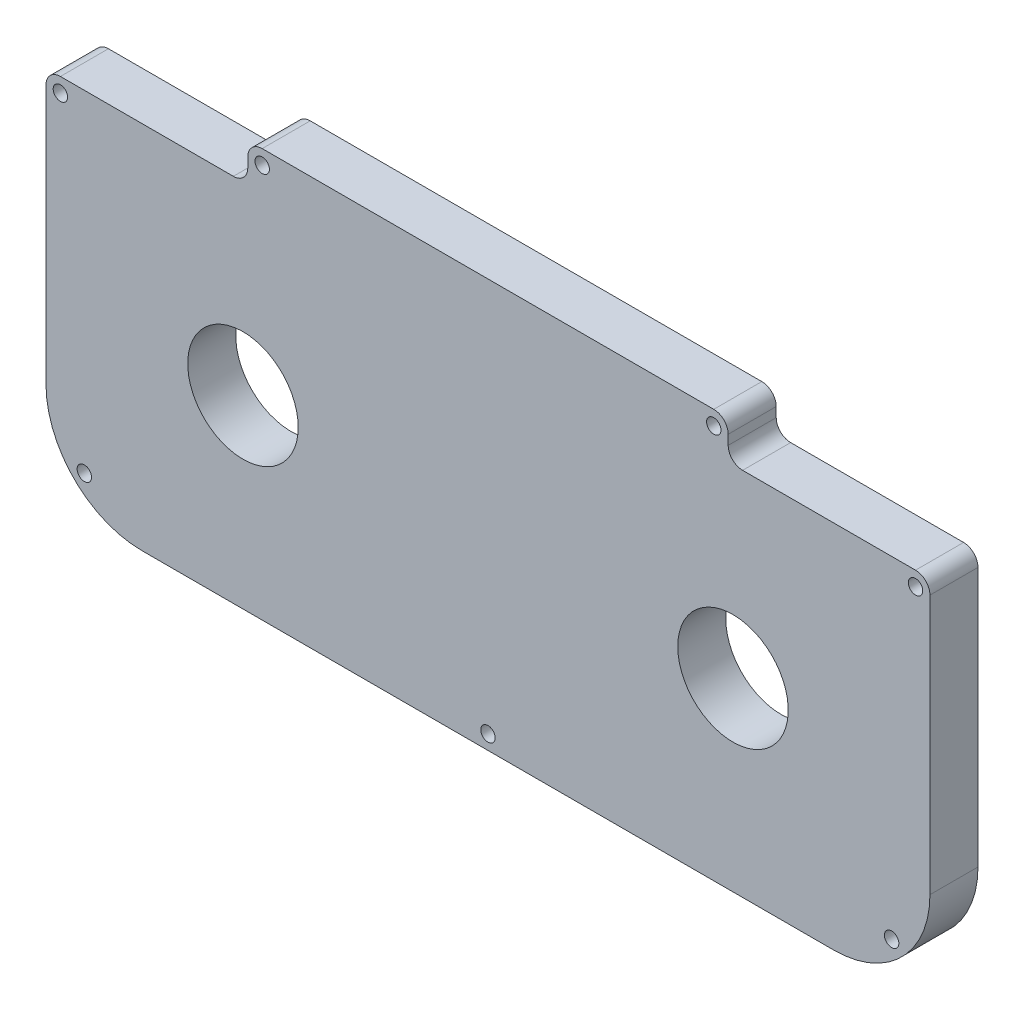
ISO-10303-21;
HEADER;
FILE_DESCRIPTION(('STEP AP214'),'2;1');
FILE_NAME('part.step','',(''),(''),'','','');
FILE_SCHEMA(('AUTOMOTIVE_DESIGN { 1 0 10303 214 1 1 1 1 }'));
ENDSEC;
DATA;
#1=APPLICATION_CONTEXT('core data for automotive mechanical design processes');
#2=APPLICATION_PROTOCOL_DEFINITION('international standard','automotive_design',2000,#1);
#3=PRODUCT_CONTEXT('',#1,'mechanical');
#4=PRODUCT('Part','Part','',(#3));
#5=PRODUCT_RELATED_PRODUCT_CATEGORY('part','',(#4));
#6=PRODUCT_DEFINITION_FORMATION('','',#4);
#7=PRODUCT_DEFINITION_CONTEXT('part definition',#1,'design');
#8=PRODUCT_DEFINITION('design','',#6,#7);
#9=PRODUCT_DEFINITION_SHAPE('','',#8);
#10=(LENGTH_UNIT() NAMED_UNIT(*) SI_UNIT(.MILLI.,.METRE.));
#11=(NAMED_UNIT(*) PLANE_ANGLE_UNIT() SI_UNIT($,.RADIAN.));
#12=(NAMED_UNIT(*) SI_UNIT($,.STERADIAN.) SOLID_ANGLE_UNIT());
#13=UNCERTAINTY_MEASURE_WITH_UNIT(LENGTH_MEASURE(1.E-05),#10,'distance_accuracy_value','');
#14=(GEOMETRIC_REPRESENTATION_CONTEXT(3) GLOBAL_UNCERTAINTY_ASSIGNED_CONTEXT((#13)) GLOBAL_UNIT_ASSIGNED_CONTEXT((#10,
#11,#12)) REPRESENTATION_CONTEXT('',''));
#15=CARTESIAN_POINT('',(0.,0.,0.));
#16=DIRECTION('',(0.,0.,1.));
#17=DIRECTION('',(1.,0.,0.));
#18=AXIS2_PLACEMENT_3D('',#15,#16,#17);
#19=CARTESIAN_POINT('',(47.,39.5,10.));
#20=DIRECTION('',(0.,0.,1.));
#21=DIRECTION('',(1.,0.,0.));
#22=AXIS2_PLACEMENT_3D('',#19,#20,#21);
#23=PLANE('',#22);
#24=CARTESIAN_POINT('',(-84.0208152801713,-34.5208152801713,10.));
#25=DIRECTION('',(0.,0.,1.));
#26=DIRECTION('',(1.,0.,0.));
#27=AXIS2_PLACEMENT_3D('',#24,#25,#26);
#28=CIRCLE('',#27,1.5);
#29=CARTESIAN_POINT('',(-82.5208152801713,-34.5208152801713,10.));
#30=VERTEX_POINT('',#29);
#31=EDGE_CURVE('E372',#30,#30,#28,.T.);
#32=ORIENTED_EDGE('',*,*,#31,.F.);
#33=EDGE_LOOP('',(#32));
#34=FACE_BOUND('',#33,.T.);
#35=CARTESIAN_POINT('',(-47.,39.5,10.));
#36=DIRECTION('',(0.,0.,1.));
#37=DIRECTION('',(1.,0.,0.));
#38=AXIS2_PLACEMENT_3D('',#35,#36,#37);
#39=CIRCLE('',#38,1.5);
#40=CARTESIAN_POINT('',(-45.5,39.5,10.));
#41=VERTEX_POINT('',#40);
#42=EDGE_CURVE('E384',#41,#41,#39,.T.);
#43=ORIENTED_EDGE('',*,*,#42,.F.);
#44=EDGE_LOOP('',(#43));
#45=FACE_BOUND('',#44,.T.);
#46=CARTESIAN_POINT('',(89.,31.5,10.));
#47=DIRECTION('',(0.,0.,1.));
#48=DIRECTION('',(1.,0.,0.));
#49=AXIS2_PLACEMENT_3D('',#46,#47,#48);
#50=CIRCLE('',#49,1.50000000000001);
#51=CARTESIAN_POINT('',(90.5,31.5,10.));
#52=VERTEX_POINT('',#51);
#53=EDGE_CURVE('E396',#52,#52,#50,.T.);
#54=ORIENTED_EDGE('',*,*,#53,.F.);
#55=EDGE_LOOP('',(#54));
#56=FACE_BOUND('',#55,.T.);
#57=CARTESIAN_POINT('',(0.,-39.5,10.));
#58=DIRECTION('',(0.,0.,1.));
#59=DIRECTION('',(1.,0.,0.));
#60=AXIS2_PLACEMENT_3D('',#57,#58,#59);
#61=CIRCLE('',#60,1.5);
#62=CARTESIAN_POINT('',(1.5,-39.5,10.));
#63=VERTEX_POINT('',#62);
#64=EDGE_CURVE('E408',#63,#63,#61,.T.);
#65=ORIENTED_EDGE('',*,*,#64,.F.);
#66=EDGE_LOOP('',(#65));
#67=FACE_BOUND('',#66,.T.);
#68=CARTESIAN_POINT('',(47.,39.5,10.));
#69=DIRECTION('',(0.,0.,1.));
#70=DIRECTION('',(1.,0.,0.));
#71=AXIS2_PLACEMENT_3D('',#68,#69,#70);
#72=CIRCLE('',#71,3.);
#73=CARTESIAN_POINT('',(50.,39.5,10.));
#74=VERTEX_POINT('',#73);
#75=CARTESIAN_POINT('',(47.,42.5,10.));
#76=VERTEX_POINT('',#75);
#77=EDGE_CURVE('E219',#74,#76,#72,.T.);
#78=ORIENTED_EDGE('',*,*,#77,.T.);
#79=DIRECTION('',(-1.,0.,0.));
#80=VECTOR('',#79,1.);
#81=CARTESIAN_POINT('',(-47.,42.5,10.));
#82=LINE('',#81,#80);
#83=CARTESIAN_POINT('',(-47.,42.5,10.));
#84=VERTEX_POINT('',#83);
#85=EDGE_CURVE('E127',#76,#84,#82,.T.);
#86=ORIENTED_EDGE('',*,*,#85,.T.);
#87=CARTESIAN_POINT('',(-47.,39.5,10.));
#88=DIRECTION('',(0.,0.,1.));
#89=DIRECTION('',(1.,0.,0.));
#90=AXIS2_PLACEMENT_3D('',#87,#88,#89);
#91=CIRCLE('',#90,3.);
#92=CARTESIAN_POINT('',(-50.,39.5,10.));
#93=VERTEX_POINT('',#92);
#94=EDGE_CURVE('E258',#84,#93,#91,.T.);
#95=ORIENTED_EDGE('',*,*,#94,.T.);
#96=DIRECTION('',(0.,-1.,0.));
#97=VECTOR('',#96,1.);
#98=CARTESIAN_POINT('',(-50.,39.5,10.));
#99=LINE('',#98,#97);
#100=CARTESIAN_POINT('',(-50.,37.5,10.));
#101=VERTEX_POINT('',#100);
#102=EDGE_CURVE('E277',#93,#101,#99,.T.);
#103=ORIENTED_EDGE('',*,*,#102,.T.);
#104=CARTESIAN_POINT('',(-53.,37.5,10.));
#105=DIRECTION('',(0.,0.,-1.));
#106=DIRECTION('',(1.,0.,0.));
#107=AXIS2_PLACEMENT_3D('',#104,#105,#106);
#108=CIRCLE('',#107,3.);
#109=CARTESIAN_POINT('',(-53.,34.5,10.));
#110=VERTEX_POINT('',#109);
#111=EDGE_CURVE('E274',#101,#110,#108,.T.);
#112=ORIENTED_EDGE('',*,*,#111,.T.);
#113=DIRECTION('',(-1.,0.,0.));
#114=VECTOR('',#113,1.);
#115=CARTESIAN_POINT('',(-89.,34.5,10.));
#116=LINE('',#115,#114);
#117=CARTESIAN_POINT('',(-89.,34.5,10.));
#118=VERTEX_POINT('',#117);
#119=EDGE_CURVE('E276',#110,#118,#116,.T.);
#120=ORIENTED_EDGE('',*,*,#119,.T.);
#121=CARTESIAN_POINT('',(-89.,31.5,10.));
#122=DIRECTION('',(0.,0.,1.));
#123=DIRECTION('',(1.,0.,0.));
#124=AXIS2_PLACEMENT_3D('',#121,#122,#123);
#125=CIRCLE('',#124,3.);
#126=CARTESIAN_POINT('',(-92.,31.5,10.));
#127=VERTEX_POINT('',#126);
#128=EDGE_CURVE('E279',#118,#127,#125,.T.);
#129=ORIENTED_EDGE('',*,*,#128,.T.);
#130=DIRECTION('',(0.,-1.,0.));
#131=VECTOR('',#130,1.);
#132=CARTESIAN_POINT('',(-92.,-22.4999999999999,10.));
#133=LINE('',#132,#131);
#134=CARTESIAN_POINT('',(-92.,-22.4999999999999,10.));
#135=VERTEX_POINT('',#134);
#136=EDGE_CURVE('E285',#127,#135,#133,.T.);
#137=ORIENTED_EDGE('',*,*,#136,.T.);
#138=CARTESIAN_POINT('',(-71.9999999999999,-22.4999999999999,10.));
#139=DIRECTION('',(0.,0.,1.));
#140=DIRECTION('',(1.,0.,0.));
#141=AXIS2_PLACEMENT_3D('',#138,#139,#140);
#142=CIRCLE('',#141,20.0000000000001);
#143=CARTESIAN_POINT('',(-71.9999999999999,-42.5,10.));
#144=VERTEX_POINT('',#143);
#145=EDGE_CURVE('E287',#135,#144,#142,.T.);
#146=ORIENTED_EDGE('',*,*,#145,.T.);
#147=DIRECTION('',(1.,0.,0.));
#148=VECTOR('',#147,1.);
#149=CARTESIAN_POINT('',(-71.9999999999999,-42.5,10.));
#150=LINE('',#149,#148);
#151=CARTESIAN_POINT('',(71.9999999999999,-42.5,10.));
#152=VERTEX_POINT('',#151);
#153=EDGE_CURVE('E289',#144,#152,#150,.T.);
#154=ORIENTED_EDGE('',*,*,#153,.T.);
#155=CARTESIAN_POINT('',(71.9999999999999,-22.4999999999999,10.));
#156=DIRECTION('',(0.,0.,1.));
#157=DIRECTION('',(1.,0.,0.));
#158=AXIS2_PLACEMENT_3D('',#155,#156,#157);
#159=CIRCLE('',#158,20.0000000000001);
#160=CARTESIAN_POINT('',(92.,-22.4999999999999,10.));
#161=VERTEX_POINT('',#160);
#162=EDGE_CURVE('E291',#152,#161,#159,.T.);
#163=ORIENTED_EDGE('',*,*,#162,.T.);
#164=DIRECTION('',(0.,1.,0.));
#165=VECTOR('',#164,1.);
#166=CARTESIAN_POINT('',(92.,-22.4999999999999,10.));
#167=LINE('',#166,#165);
#168=CARTESIAN_POINT('',(92.,31.5,10.));
#169=VERTEX_POINT('',#168);
#170=EDGE_CURVE('E293',#161,#169,#167,.T.);
#171=ORIENTED_EDGE('',*,*,#170,.T.);
#172=CARTESIAN_POINT('',(89.,31.5,10.));
#173=DIRECTION('',(0.,0.,1.));
#174=DIRECTION('',(1.,0.,0.));
#175=AXIS2_PLACEMENT_3D('',#172,#173,#174);
#176=CIRCLE('',#175,3.);
#177=CARTESIAN_POINT('',(89.,34.5,10.));
#178=VERTEX_POINT('',#177);
#179=EDGE_CURVE('E170',#169,#178,#176,.T.);
#180=ORIENTED_EDGE('',*,*,#179,.T.);
#181=DIRECTION('',(-1.,0.,0.));
#182=VECTOR('',#181,1.);
#183=CARTESIAN_POINT('',(89.,34.5,10.));
#184=LINE('',#183,#182);
#185=CARTESIAN_POINT('',(53.,34.5,10.));
#186=VERTEX_POINT('',#185);
#187=EDGE_CURVE('E164',#178,#186,#184,.T.);
#188=ORIENTED_EDGE('',*,*,#187,.T.);
#189=CARTESIAN_POINT('',(53.,37.5,10.));
#190=DIRECTION('',(0.,0.,-1.));
#191=DIRECTION('',(1.,0.,0.));
#192=AXIS2_PLACEMENT_3D('',#189,#190,#191);
#193=CIRCLE('',#192,3.);
#194=CARTESIAN_POINT('',(50.,37.5,10.));
#195=VERTEX_POINT('',#194);
#196=EDGE_CURVE('E168',#186,#195,#193,.T.);
#197=ORIENTED_EDGE('',*,*,#196,.T.);
#198=DIRECTION('',(0.,1.,0.));
#199=VECTOR('',#198,1.);
#200=CARTESIAN_POINT('',(50.,39.5,10.));
#201=LINE('',#200,#199);
#202=EDGE_CURVE('E60',#195,#74,#201,.T.);
#203=ORIENTED_EDGE('',*,*,#202,.T.);
#204=EDGE_LOOP('',(#78,#86,#95,#103,#112,#120,#129,#137,#146,#154,#163,#171,#180,#188,#197,#203));
#205=FACE_BOUND('',#204,.T.);
#206=CARTESIAN_POINT('',(51.,-4.,10.));
#207=DIRECTION('',(0.,0.,1.));
#208=DIRECTION('',(-1.,0.,0.));
#209=AXIS2_PLACEMENT_3D('',#206,#207,#208);
#210=CIRCLE('',#209,11.5);
#211=CARTESIAN_POINT('',(39.5,-4.,10.));
#212=VERTEX_POINT('',#211);
#213=EDGE_CURVE('E192',#212,#212,#210,.T.);
#214=ORIENTED_EDGE('',*,*,#213,.F.);
#215=EDGE_LOOP('',(#214));
#216=FACE_BOUND('',#215,.T.);
#217=CARTESIAN_POINT('',(84.0208152801713,-34.5208152801713,10.));
#218=DIRECTION('',(0.,0.,1.));
#219=DIRECTION('',(1.,0.,0.));
#220=AXIS2_PLACEMENT_3D('',#217,#218,#219);
#221=CIRCLE('',#220,1.5);
#222=CARTESIAN_POINT('',(85.5208152801713,-34.5208152801713,10.));
#223=VERTEX_POINT('',#222);
#224=EDGE_CURVE('E402',#223,#223,#221,.T.);
#225=ORIENTED_EDGE('',*,*,#224,.F.);
#226=EDGE_LOOP('',(#225));
#227=FACE_BOUND('',#226,.T.);
#228=CARTESIAN_POINT('',(47.,39.5,10.));
#229=DIRECTION('',(0.,0.,1.));
#230=DIRECTION('',(1.,0.,0.));
#231=AXIS2_PLACEMENT_3D('',#228,#229,#230);
#232=CIRCLE('',#231,1.50000000000003);
#233=CARTESIAN_POINT('',(48.5,39.5,10.));
#234=VERTEX_POINT('',#233);
#235=EDGE_CURVE('E390',#234,#234,#232,.T.);
#236=ORIENTED_EDGE('',*,*,#235,.F.);
#237=EDGE_LOOP('',(#236));
#238=FACE_BOUND('',#237,.T.);
#239=CARTESIAN_POINT('',(-89.,31.5,10.));
#240=DIRECTION('',(0.,0.,1.));
#241=DIRECTION('',(1.,0.,0.));
#242=AXIS2_PLACEMENT_3D('',#239,#240,#241);
#243=CIRCLE('',#242,1.50000000000001);
#244=CARTESIAN_POINT('',(-87.5,31.5,10.));
#245=VERTEX_POINT('',#244);
#246=EDGE_CURVE('E378',#245,#245,#243,.T.);
#247=ORIENTED_EDGE('',*,*,#246,.F.);
#248=EDGE_LOOP('',(#247));
#249=FACE_BOUND('',#248,.T.);
#250=CARTESIAN_POINT('',(-51.,-4.,10.));
#251=DIRECTION('',(0.,0.,1.));
#252=DIRECTION('',(1.,0.,0.));
#253=AXIS2_PLACEMENT_3D('',#250,#251,#252);
#254=CIRCLE('',#253,11.5);
#255=CARTESIAN_POINT('',(-39.5,-4.,10.));
#256=VERTEX_POINT('',#255);
#257=EDGE_CURVE('E363',#256,#256,#254,.T.);
#258=ORIENTED_EDGE('',*,*,#257,.F.);
#259=EDGE_LOOP('',(#258));
#260=FACE_BOUND('',#259,.T.);
#261=ADVANCED_FACE('F43',(#34,#45,#56,#67,#205,#216,#227,#238,#249,#260),#23,.T.);
#262=CARTESIAN_POINT('',(47.,39.5,0.));
#263=DIRECTION('',(0.,0.,1.));
#264=DIRECTION('',(1.,0.,0.));
#265=AXIS2_PLACEMENT_3D('',#262,#263,#264);
#266=PLANE('',#265);
#267=CARTESIAN_POINT('',(47.,39.5,0.));
#268=DIRECTION('',(0.,0.,1.));
#269=DIRECTION('',(1.,0.,0.));
#270=AXIS2_PLACEMENT_3D('',#267,#268,#269);
#271=CIRCLE('',#270,3.);
#272=CARTESIAN_POINT('',(50.,39.5,0.));
#273=VERTEX_POINT('',#272);
#274=CARTESIAN_POINT('',(47.,42.5,0.));
#275=VERTEX_POINT('',#274);
#276=EDGE_CURVE('E188',#273,#275,#271,.T.);
#277=ORIENTED_EDGE('',*,*,#276,.F.);
#278=DIRECTION('',(0.,1.,0.));
#279=VECTOR('',#278,1.);
#280=CARTESIAN_POINT('',(50.,39.5,0.));
#281=LINE('',#280,#279);
#282=CARTESIAN_POINT('',(50.,37.5,0.));
#283=VERTEX_POINT('',#282);
#284=EDGE_CURVE('E119',#283,#273,#281,.T.);
#285=ORIENTED_EDGE('',*,*,#284,.F.);
#286=CARTESIAN_POINT('',(53.,37.5,0.));
#287=DIRECTION('',(0.,0.,-1.));
#288=DIRECTION('',(1.,0.,0.));
#289=AXIS2_PLACEMENT_3D('',#286,#287,#288);
#290=CIRCLE('',#289,3.);
#291=CARTESIAN_POINT('',(53.,34.5,0.));
#292=VERTEX_POINT('',#291);
#293=EDGE_CURVE('E113',#292,#283,#290,.T.);
#294=ORIENTED_EDGE('',*,*,#293,.F.);
#295=DIRECTION('',(-1.,0.,0.));
#296=VECTOR('',#295,1.);
#297=CARTESIAN_POINT('',(89.,34.5,0.));
#298=LINE('',#297,#296);
#299=CARTESIAN_POINT('',(89.,34.5,0.));
#300=VERTEX_POINT('',#299);
#301=EDGE_CURVE('E178',#300,#292,#298,.T.);
#302=ORIENTED_EDGE('',*,*,#301,.F.);
#303=CARTESIAN_POINT('',(89.,31.5,0.));
#304=DIRECTION('',(0.,0.,1.));
#305=DIRECTION('',(1.,0.,0.));
#306=AXIS2_PLACEMENT_3D('',#303,#304,#305);
#307=CIRCLE('',#306,3.);
#308=CARTESIAN_POINT('',(92.,31.5,0.));
#309=VERTEX_POINT('',#308);
#310=EDGE_CURVE('E214',#309,#300,#307,.T.);
#311=ORIENTED_EDGE('',*,*,#310,.F.);
#312=DIRECTION('',(0.,1.,0.));
#313=VECTOR('',#312,1.);
#314=CARTESIAN_POINT('',(92.,-22.4999999999999,0.));
#315=LINE('',#314,#313);
#316=CARTESIAN_POINT('',(92.,-22.4999999999999,0.));
#317=VERTEX_POINT('',#316);
#318=EDGE_CURVE('E212',#317,#309,#315,.T.);
#319=ORIENTED_EDGE('',*,*,#318,.F.);
#320=CARTESIAN_POINT('',(71.9999999999999,-22.4999999999999,0.));
#321=DIRECTION('',(0.,0.,1.));
#322=DIRECTION('',(1.,0.,0.));
#323=AXIS2_PLACEMENT_3D('',#320,#321,#322);
#324=CIRCLE('',#323,20.0000000000001);
#325=CARTESIAN_POINT('',(71.9999999999999,-42.5,0.));
#326=VERTEX_POINT('',#325);
#327=EDGE_CURVE('E210',#326,#317,#324,.T.);
#328=ORIENTED_EDGE('',*,*,#327,.F.);
#329=DIRECTION('',(1.,0.,0.));
#330=VECTOR('',#329,1.);
#331=CARTESIAN_POINT('',(-71.9999999999999,-42.5,0.));
#332=LINE('',#331,#330);
#333=CARTESIAN_POINT('',(-71.9999999999999,-42.5,0.));
#334=VERTEX_POINT('',#333);
#335=EDGE_CURVE('E208',#334,#326,#332,.T.);
#336=ORIENTED_EDGE('',*,*,#335,.F.);
#337=CARTESIAN_POINT('',(-71.9999999999999,-22.4999999999999,0.));
#338=DIRECTION('',(0.,0.,1.));
#339=DIRECTION('',(1.,0.,0.));
#340=AXIS2_PLACEMENT_3D('',#337,#338,#339);
#341=CIRCLE('',#340,20.0000000000001);
#342=CARTESIAN_POINT('',(-92.,-22.4999999999999,0.));
#343=VERTEX_POINT('',#342);
#344=EDGE_CURVE('E206',#343,#334,#341,.T.);
#345=ORIENTED_EDGE('',*,*,#344,.F.);
#346=DIRECTION('',(0.,-1.,0.));
#347=VECTOR('',#346,1.);
#348=CARTESIAN_POINT('',(-92.,-22.4999999999999,0.));
#349=LINE('',#348,#347);
#350=CARTESIAN_POINT('',(-92.,31.5,0.));
#351=VERTEX_POINT('',#350);
#352=EDGE_CURVE('E204',#351,#343,#349,.T.);
#353=ORIENTED_EDGE('',*,*,#352,.F.);
#354=CARTESIAN_POINT('',(-89.,31.5,0.));
#355=DIRECTION('',(0.,0.,1.));
#356=DIRECTION('',(1.,0.,0.));
#357=AXIS2_PLACEMENT_3D('',#354,#355,#356);
#358=CIRCLE('',#357,3.);
#359=CARTESIAN_POINT('',(-89.,34.5,0.));
#360=VERTEX_POINT('',#359);
#361=EDGE_CURVE('E202',#360,#351,#358,.T.);
#362=ORIENTED_EDGE('',*,*,#361,.F.);
#363=DIRECTION('',(-1.,0.,0.));
#364=VECTOR('',#363,1.);
#365=CARTESIAN_POINT('',(-89.,34.5,0.));
#366=LINE('',#365,#364);
#367=CARTESIAN_POINT('',(-53.,34.5,0.));
#368=VERTEX_POINT('',#367);
#369=EDGE_CURVE('E200',#368,#360,#366,.T.);
#370=ORIENTED_EDGE('',*,*,#369,.F.);
#371=CARTESIAN_POINT('',(-53.,37.5,0.));
#372=DIRECTION('',(0.,0.,-1.));
#373=DIRECTION('',(1.,0.,0.));
#374=AXIS2_PLACEMENT_3D('',#371,#372,#373);
#375=CIRCLE('',#374,3.);
#376=CARTESIAN_POINT('',(-50.,37.5,0.));
#377=VERTEX_POINT('',#376);
#378=EDGE_CURVE('E198',#377,#368,#375,.T.);
#379=ORIENTED_EDGE('',*,*,#378,.F.);
#380=DIRECTION('',(0.,-1.,0.));
#381=VECTOR('',#380,1.);
#382=CARTESIAN_POINT('',(-50.,39.5,0.));
#383=LINE('',#382,#381);
#384=CARTESIAN_POINT('',(-50.,39.5,0.));
#385=VERTEX_POINT('',#384);
#386=EDGE_CURVE('E196',#385,#377,#383,.T.);
#387=ORIENTED_EDGE('',*,*,#386,.F.);
#388=CARTESIAN_POINT('',(-47.,39.5,0.));
#389=DIRECTION('',(0.,0.,1.));
#390=DIRECTION('',(1.,0.,0.));
#391=AXIS2_PLACEMENT_3D('',#388,#389,#390);
#392=CIRCLE('',#391,3.);
#393=CARTESIAN_POINT('',(-47.,42.5,0.));
#394=VERTEX_POINT('',#393);
#395=EDGE_CURVE('E194',#394,#385,#392,.T.);
#396=ORIENTED_EDGE('',*,*,#395,.F.);
#397=DIRECTION('',(-1.,0.,0.));
#398=VECTOR('',#397,1.);
#399=CARTESIAN_POINT('',(-47.,42.5,0.));
#400=LINE('',#399,#398);
#401=EDGE_CURVE('E191',#275,#394,#400,.T.);
#402=ORIENTED_EDGE('',*,*,#401,.F.);
#403=EDGE_LOOP('',(#277,#285,#294,#302,#311,#319,#328,#336,#345,#353,#362,#370,#379,#387,#396,#402));
#404=FACE_BOUND('',#403,.T.);
#405=CARTESIAN_POINT('',(51.,-4.,0.));
#406=DIRECTION('',(0.,0.,1.));
#407=DIRECTION('',(-1.,0.,0.));
#408=AXIS2_PLACEMENT_3D('',#405,#406,#407);
#409=CIRCLE('',#408,11.5);
#410=CARTESIAN_POINT('',(39.5,-4.,0.));
#411=VERTEX_POINT('',#410);
#412=EDGE_CURVE('E411',#411,#411,#409,.T.);
#413=ORIENTED_EDGE('',*,*,#412,.T.);
#414=EDGE_LOOP('',(#413));
#415=FACE_BOUND('',#414,.T.);
#416=CARTESIAN_POINT('',(0.,-39.5,0.));
#417=DIRECTION('',(0.,0.,1.));
#418=DIRECTION('',(1.,0.,0.));
#419=AXIS2_PLACEMENT_3D('',#416,#417,#418);
#420=CIRCLE('',#419,1.5);
#421=CARTESIAN_POINT('',(1.5,-39.5,0.));
#422=VERTEX_POINT('',#421);
#423=EDGE_CURVE('E405',#422,#422,#420,.T.);
#424=ORIENTED_EDGE('',*,*,#423,.T.);
#425=EDGE_LOOP('',(#424));
#426=FACE_BOUND('',#425,.T.);
#427=CARTESIAN_POINT('',(84.0208152801713,-34.5208152801713,0.));
#428=DIRECTION('',(0.,0.,1.));
#429=DIRECTION('',(1.,0.,0.));
#430=AXIS2_PLACEMENT_3D('',#427,#428,#429);
#431=CIRCLE('',#430,1.5);
#432=CARTESIAN_POINT('',(85.5208152801713,-34.5208152801713,0.));
#433=VERTEX_POINT('',#432);
#434=EDGE_CURVE('E399',#433,#433,#431,.T.);
#435=ORIENTED_EDGE('',*,*,#434,.T.);
#436=EDGE_LOOP('',(#435));
#437=FACE_BOUND('',#436,.T.);
#438=CARTESIAN_POINT('',(89.,31.5,0.));
#439=DIRECTION('',(0.,0.,1.));
#440=DIRECTION('',(1.,0.,0.));
#441=AXIS2_PLACEMENT_3D('',#438,#439,#440);
#442=CIRCLE('',#441,1.50000000000001);
#443=CARTESIAN_POINT('',(90.5,31.5,0.));
#444=VERTEX_POINT('',#443);
#445=EDGE_CURVE('E393',#444,#444,#442,.T.);
#446=ORIENTED_EDGE('',*,*,#445,.T.);
#447=EDGE_LOOP('',(#446));
#448=FACE_BOUND('',#447,.T.);
#449=CARTESIAN_POINT('',(47.,39.5,0.));
#450=DIRECTION('',(0.,0.,1.));
#451=DIRECTION('',(1.,0.,0.));
#452=AXIS2_PLACEMENT_3D('',#449,#450,#451);
#453=CIRCLE('',#452,1.50000000000003);
#454=CARTESIAN_POINT('',(48.5,39.5,0.));
#455=VERTEX_POINT('',#454);
#456=EDGE_CURVE('E387',#455,#455,#453,.T.);
#457=ORIENTED_EDGE('',*,*,#456,.T.);
#458=EDGE_LOOP('',(#457));
#459=FACE_BOUND('',#458,.T.);
#460=CARTESIAN_POINT('',(-47.,39.5,0.));
#461=DIRECTION('',(0.,0.,1.));
#462=DIRECTION('',(1.,0.,0.));
#463=AXIS2_PLACEMENT_3D('',#460,#461,#462);
#464=CIRCLE('',#463,1.5);
#465=CARTESIAN_POINT('',(-45.5,39.5,0.));
#466=VERTEX_POINT('',#465);
#467=EDGE_CURVE('E381',#466,#466,#464,.T.);
#468=ORIENTED_EDGE('',*,*,#467,.T.);
#469=EDGE_LOOP('',(#468));
#470=FACE_BOUND('',#469,.T.);
#471=CARTESIAN_POINT('',(-89.,31.5,0.));
#472=DIRECTION('',(0.,0.,1.));
#473=DIRECTION('',(1.,0.,0.));
#474=AXIS2_PLACEMENT_3D('',#471,#472,#473);
#475=CIRCLE('',#474,1.50000000000001);
#476=CARTESIAN_POINT('',(-87.5,31.5,0.));
#477=VERTEX_POINT('',#476);
#478=EDGE_CURVE('E375',#477,#477,#475,.T.);
#479=ORIENTED_EDGE('',*,*,#478,.T.);
#480=EDGE_LOOP('',(#479));
#481=FACE_BOUND('',#480,.T.);
#482=CARTESIAN_POINT('',(-84.0208152801713,-34.5208152801713,0.));
#483=DIRECTION('',(0.,0.,1.));
#484=DIRECTION('',(1.,0.,0.));
#485=AXIS2_PLACEMENT_3D('',#482,#483,#484);
#486=CIRCLE('',#485,1.5);
#487=CARTESIAN_POINT('',(-82.5208152801713,-34.5208152801713,0.));
#488=VERTEX_POINT('',#487);
#489=EDGE_CURVE('E369',#488,#488,#486,.T.);
#490=ORIENTED_EDGE('',*,*,#489,.T.);
#491=EDGE_LOOP('',(#490));
#492=FACE_BOUND('',#491,.T.);
#493=CARTESIAN_POINT('',(-51.,-4.,0.));
#494=DIRECTION('',(0.,0.,1.));
#495=DIRECTION('',(1.,0.,0.));
#496=AXIS2_PLACEMENT_3D('',#493,#494,#495);
#497=CIRCLE('',#496,11.5);
#498=CARTESIAN_POINT('',(-39.5,-4.,0.));
#499=VERTEX_POINT('',#498);
#500=EDGE_CURVE('E366',#499,#499,#497,.T.);
#501=ORIENTED_EDGE('',*,*,#500,.T.);
#502=EDGE_LOOP('',(#501));
#503=FACE_BOUND('',#502,.T.);
#504=ADVANCED_FACE('F262',(#404,#415,#426,#437,#448,#459,#470,#481,#492,#503),#266,.F.);
#505=CARTESIAN_POINT('',(47.,39.5,10.));
#506=DIRECTION('',(0.,0.,-1.));
#507=DIRECTION('',(-1.,0.,0.));
#508=AXIS2_PLACEMENT_3D('',#505,#506,#507);
#509=CYLINDRICAL_SURFACE('',#508,3.);
#510=ORIENTED_EDGE('',*,*,#276,.T.);
#511=DIRECTION('',(0.,0.,-1.));
#512=VECTOR('',#511,1.);
#513=CARTESIAN_POINT('',(47.,42.5,10.));
#514=LINE('',#513,#512);
#515=EDGE_CURVE('E11',#76,#275,#514,.T.);
#516=ORIENTED_EDGE('',*,*,#515,.F.);
#517=ORIENTED_EDGE('',*,*,#77,.F.);
#518=DIRECTION('',(0.,0.,-1.));
#519=VECTOR('',#518,1.);
#520=CARTESIAN_POINT('',(50.,39.5,10.));
#521=LINE('',#520,#519);
#522=EDGE_CURVE('E184',#74,#273,#521,.T.);
#523=ORIENTED_EDGE('',*,*,#522,.T.);
#524=EDGE_LOOP('',(#510,#516,#517,#523));
#525=FACE_BOUND('',#524,.T.);
#526=ADVANCED_FACE('F45',(#525),#509,.T.);
#527=CARTESIAN_POINT('',(-47.,42.5,10.));
#528=DIRECTION('',(0.,-1.,0.));
#529=DIRECTION('',(0.,0.,-1.));
#530=AXIS2_PLACEMENT_3D('',#527,#528,#529);
#531=PLANE('',#530);
#532=ORIENTED_EDGE('',*,*,#401,.T.);
#533=DIRECTION('',(0.,0.,-1.));
#534=VECTOR('',#533,1.);
#535=CARTESIAN_POINT('',(-47.,42.5,10.));
#536=LINE('',#535,#534);
#537=EDGE_CURVE('E52',#84,#394,#536,.T.);
#538=ORIENTED_EDGE('',*,*,#537,.F.);
#539=ORIENTED_EDGE('',*,*,#85,.F.);
#540=ORIENTED_EDGE('',*,*,#515,.T.);
#541=EDGE_LOOP('',(#532,#538,#539,#540));
#542=FACE_BOUND('',#541,.T.);
#543=ADVANCED_FACE('F622',(#542),#531,.F.);
#544=CARTESIAN_POINT('',(-47.,39.5,10.));
#545=DIRECTION('',(0.,0.,-1.));
#546=DIRECTION('',(-1.,0.,0.));
#547=AXIS2_PLACEMENT_3D('',#544,#545,#546);
#548=CYLINDRICAL_SURFACE('',#547,3.);
#549=ORIENTED_EDGE('',*,*,#395,.T.);
#550=DIRECTION('',(0.,0.,-1.));
#551=VECTOR('',#550,1.);
#552=CARTESIAN_POINT('',(-50.,39.5,10.));
#553=LINE('',#552,#551);
#554=EDGE_CURVE('E250',#93,#385,#553,.T.);
#555=ORIENTED_EDGE('',*,*,#554,.F.);
#556=ORIENTED_EDGE('',*,*,#94,.F.);
#557=ORIENTED_EDGE('',*,*,#537,.T.);
#558=EDGE_LOOP('',(#549,#555,#556,#557));
#559=FACE_BOUND('',#558,.T.);
#560=ADVANCED_FACE('F256',(#559),#548,.T.);
#561=CARTESIAN_POINT('',(-50.,39.5,10.));
#562=DIRECTION('',(1.,0.,0.));
#563=DIRECTION('',(0.,0.,-1.));
#564=AXIS2_PLACEMENT_3D('',#561,#562,#563);
#565=PLANE('',#564);
#566=ORIENTED_EDGE('',*,*,#386,.T.);
#567=DIRECTION('',(0.,0.,-1.));
#568=VECTOR('',#567,1.);
#569=CARTESIAN_POINT('',(-50.,37.5,10.));
#570=LINE('',#569,#568);
#571=EDGE_CURVE('E247',#101,#377,#570,.T.);
#572=ORIENTED_EDGE('',*,*,#571,.F.);
#573=ORIENTED_EDGE('',*,*,#102,.F.);
#574=ORIENTED_EDGE('',*,*,#554,.T.);
#575=EDGE_LOOP('',(#566,#572,#573,#574));
#576=FACE_BOUND('',#575,.T.);
#577=ADVANCED_FACE('F268',(#576),#565,.F.);
#578=CARTESIAN_POINT('',(-53.,37.5,10.));
#579=DIRECTION('',(0.,0.,-1.));
#580=DIRECTION('',(-1.,0.,0.));
#581=AXIS2_PLACEMENT_3D('',#578,#579,#580);
#582=CYLINDRICAL_SURFACE('',#581,3.);
#583=ORIENTED_EDGE('',*,*,#378,.T.);
#584=DIRECTION('',(0.,0.,-1.));
#585=VECTOR('',#584,1.);
#586=CARTESIAN_POINT('',(-53.,34.5,10.));
#587=LINE('',#586,#585);
#588=EDGE_CURVE('E244',#110,#368,#587,.T.);
#589=ORIENTED_EDGE('',*,*,#588,.F.);
#590=ORIENTED_EDGE('',*,*,#111,.F.);
#591=ORIENTED_EDGE('',*,*,#571,.T.);
#592=EDGE_LOOP('',(#583,#589,#590,#591));
#593=FACE_BOUND('',#592,.T.);
#594=ADVANCED_FACE('F272',(#593),#582,.F.);
#595=CARTESIAN_POINT('',(-89.,34.5,10.));
#596=DIRECTION('',(0.,-1.,0.));
#597=DIRECTION('',(1.,0.,0.));
#598=AXIS2_PLACEMENT_3D('',#595,#596,#597);
#599=PLANE('',#598);
#600=ORIENTED_EDGE('',*,*,#369,.T.);
#601=DIRECTION('',(0.,0.,-1.));
#602=VECTOR('',#601,1.);
#603=CARTESIAN_POINT('',(-89.,34.5,10.));
#604=LINE('',#603,#602);
#605=EDGE_CURVE('E241',#118,#360,#604,.T.);
#606=ORIENTED_EDGE('',*,*,#605,.F.);
#607=ORIENTED_EDGE('',*,*,#119,.F.);
#608=ORIENTED_EDGE('',*,*,#588,.T.);
#609=EDGE_LOOP('',(#600,#606,#607,#608));
#610=FACE_BOUND('',#609,.T.);
#611=ADVANCED_FACE('F592',(#610),#599,.F.);
#612=CARTESIAN_POINT('',(-89.,31.5,10.));
#613=DIRECTION('',(0.,0.,-1.));
#614=DIRECTION('',(-1.,0.,0.));
#615=AXIS2_PLACEMENT_3D('',#612,#613,#614);
#616=CYLINDRICAL_SURFACE('',#615,3.);
#617=ORIENTED_EDGE('',*,*,#361,.T.);
#618=DIRECTION('',(0.,0.,-1.));
#619=VECTOR('',#618,1.);
#620=CARTESIAN_POINT('',(-92.,31.5,10.));
#621=LINE('',#620,#619);
#622=EDGE_CURVE('E238',#127,#351,#621,.T.);
#623=ORIENTED_EDGE('',*,*,#622,.F.);
#624=ORIENTED_EDGE('',*,*,#128,.F.);
#625=ORIENTED_EDGE('',*,*,#605,.T.);
#626=EDGE_LOOP('',(#617,#623,#624,#625));
#627=FACE_BOUND('',#626,.T.);
#628=ADVANCED_FACE('F461',(#627),#616,.T.);
#629=CARTESIAN_POINT('',(-92.,-22.4999999999999,10.));
#630=DIRECTION('',(1.,0.,0.));
#631=DIRECTION('',(0.,1.,0.));
#632=AXIS2_PLACEMENT_3D('',#629,#630,#631);
#633=PLANE('',#632);
#634=ORIENTED_EDGE('',*,*,#352,.T.);
#635=DIRECTION('',(0.,0.,-1.));
#636=VECTOR('',#635,1.);
#637=CARTESIAN_POINT('',(-92.,-22.4999999999999,10.));
#638=LINE('',#637,#636);
#639=EDGE_CURVE('E235',#135,#343,#638,.T.);
#640=ORIENTED_EDGE('',*,*,#639,.F.);
#641=ORIENTED_EDGE('',*,*,#136,.F.);
#642=ORIENTED_EDGE('',*,*,#622,.T.);
#643=EDGE_LOOP('',(#634,#640,#641,#642));
#644=FACE_BOUND('',#643,.T.);
#645=ADVANCED_FACE('F458',(#644),#633,.F.);
#646=CARTESIAN_POINT('',(-71.9999999999999,-22.4999999999999,10.));
#647=DIRECTION('',(0.,0.,-1.));
#648=DIRECTION('',(-1.,0.,0.));
#649=AXIS2_PLACEMENT_3D('',#646,#647,#648);
#650=CYLINDRICAL_SURFACE('',#649,20.0000000000001);
#651=ORIENTED_EDGE('',*,*,#344,.T.);
#652=DIRECTION('',(0.,0.,-1.));
#653=VECTOR('',#652,1.);
#654=CARTESIAN_POINT('',(-71.9999999999999,-42.5,10.));
#655=LINE('',#654,#653);
#656=EDGE_CURVE('E232',#144,#334,#655,.T.);
#657=ORIENTED_EDGE('',*,*,#656,.F.);
#658=ORIENTED_EDGE('',*,*,#145,.F.);
#659=ORIENTED_EDGE('',*,*,#639,.T.);
#660=EDGE_LOOP('',(#651,#657,#658,#659));
#661=FACE_BOUND('',#660,.T.);
#662=ADVANCED_FACE('F460',(#661),#650,.T.);
#663=CARTESIAN_POINT('',(-71.9999999999999,-42.5,10.));
#664=DIRECTION('',(0.,1.,0.));
#665=DIRECTION('',(0.,0.,1.));
#666=AXIS2_PLACEMENT_3D('',#663,#664,#665);
#667=PLANE('',#666);
#668=ORIENTED_EDGE('',*,*,#335,.T.);
#669=DIRECTION('',(0.,0.,-1.));
#670=VECTOR('',#669,1.);
#671=CARTESIAN_POINT('',(71.9999999999999,-42.5,10.));
#672=LINE('',#671,#670);
#673=EDGE_CURVE('E229',#152,#326,#672,.T.);
#674=ORIENTED_EDGE('',*,*,#673,.F.);
#675=ORIENTED_EDGE('',*,*,#153,.F.);
#676=ORIENTED_EDGE('',*,*,#656,.T.);
#677=EDGE_LOOP('',(#668,#674,#675,#676));
#678=FACE_BOUND('',#677,.T.);
#679=ADVANCED_FACE('F477',(#678),#667,.F.);
#680=CARTESIAN_POINT('',(71.9999999999999,-22.4999999999999,10.));
#681=DIRECTION('',(0.,0.,-1.));
#682=DIRECTION('',(-1.,0.,0.));
#683=AXIS2_PLACEMENT_3D('',#680,#681,#682);
#684=CYLINDRICAL_SURFACE('',#683,20.0000000000001);
#685=ORIENTED_EDGE('',*,*,#327,.T.);
#686=DIRECTION('',(0.,0.,-1.));
#687=VECTOR('',#686,1.);
#688=CARTESIAN_POINT('',(92.,-22.4999999999999,10.));
#689=LINE('',#688,#687);
#690=EDGE_CURVE('E226',#161,#317,#689,.T.);
#691=ORIENTED_EDGE('',*,*,#690,.F.);
#692=ORIENTED_EDGE('',*,*,#162,.F.);
#693=ORIENTED_EDGE('',*,*,#673,.T.);
#694=EDGE_LOOP('',(#685,#691,#692,#693));
#695=FACE_BOUND('',#694,.T.);
#696=ADVANCED_FACE('F486',(#695),#684,.T.);
#697=CARTESIAN_POINT('',(92.,-22.4999999999999,10.));
#698=DIRECTION('',(-1.,0.,0.));
#699=DIRECTION('',(0.,0.,1.));
#700=AXIS2_PLACEMENT_3D('',#697,#698,#699);
#701=PLANE('',#700);
#702=ORIENTED_EDGE('',*,*,#318,.T.);
#703=DIRECTION('',(0.,0.,-1.));
#704=VECTOR('',#703,1.);
#705=CARTESIAN_POINT('',(92.,31.5,10.));
#706=LINE('',#705,#704);
#707=EDGE_CURVE('E223',#169,#309,#706,.T.);
#708=ORIENTED_EDGE('',*,*,#707,.F.);
#709=ORIENTED_EDGE('',*,*,#170,.F.);
#710=ORIENTED_EDGE('',*,*,#690,.T.);
#711=EDGE_LOOP('',(#702,#708,#709,#710));
#712=FACE_BOUND('',#711,.T.);
#713=ADVANCED_FACE('F299',(#712),#701,.F.);
#714=CARTESIAN_POINT('',(89.,31.5,10.));
#715=DIRECTION('',(0.,0.,-1.));
#716=DIRECTION('',(-1.,0.,0.));
#717=AXIS2_PLACEMENT_3D('',#714,#715,#716);
#718=CYLINDRICAL_SURFACE('',#717,3.);
#719=ORIENTED_EDGE('',*,*,#310,.T.);
#720=DIRECTION('',(0.,0.,-1.));
#721=VECTOR('',#720,1.);
#722=CARTESIAN_POINT('',(89.,34.5,10.));
#723=LINE('',#722,#721);
#724=EDGE_CURVE('E179',#178,#300,#723,.T.);
#725=ORIENTED_EDGE('',*,*,#724,.F.);
#726=ORIENTED_EDGE('',*,*,#179,.F.);
#727=ORIENTED_EDGE('',*,*,#707,.T.);
#728=EDGE_LOOP('',(#719,#725,#726,#727));
#729=FACE_BOUND('',#728,.T.);
#730=ADVANCED_FACE('F303',(#729),#718,.T.);
#731=CARTESIAN_POINT('',(89.,34.5,10.));
#732=DIRECTION('',(0.,-1.,0.));
#733=DIRECTION('',(1.,0.,0.));
#734=AXIS2_PLACEMENT_3D('',#731,#732,#733);
#735=PLANE('',#734);
#736=ORIENTED_EDGE('',*,*,#301,.T.);
#737=DIRECTION('',(0.,0.,-1.));
#738=VECTOR('',#737,1.);
#739=CARTESIAN_POINT('',(53.,34.5,10.));
#740=LINE('',#739,#738);
#741=EDGE_CURVE('E175',#186,#292,#740,.T.);
#742=ORIENTED_EDGE('',*,*,#741,.F.);
#743=ORIENTED_EDGE('',*,*,#187,.F.);
#744=ORIENTED_EDGE('',*,*,#724,.T.);
#745=EDGE_LOOP('',(#736,#742,#743,#744));
#746=FACE_BOUND('',#745,.T.);
#747=ADVANCED_FACE('F176',(#746),#735,.F.);
#748=CARTESIAN_POINT('',(53.,37.5,10.));
#749=DIRECTION('',(0.,0.,-1.));
#750=DIRECTION('',(-1.,0.,0.));
#751=AXIS2_PLACEMENT_3D('',#748,#749,#750);
#752=CYLINDRICAL_SURFACE('',#751,3.);
#753=ORIENTED_EDGE('',*,*,#293,.T.);
#754=DIRECTION('',(0.,0.,-1.));
#755=VECTOR('',#754,1.);
#756=CARTESIAN_POINT('',(50.,37.5,10.));
#757=LINE('',#756,#755);
#758=EDGE_CURVE('E180',#195,#283,#757,.T.);
#759=ORIENTED_EDGE('',*,*,#758,.F.);
#760=ORIENTED_EDGE('',*,*,#196,.F.);
#761=ORIENTED_EDGE('',*,*,#741,.T.);
#762=EDGE_LOOP('',(#753,#759,#760,#761));
#763=FACE_BOUND('',#762,.T.);
#764=ADVANCED_FACE('F182',(#763),#752,.F.);
#765=CARTESIAN_POINT('',(50.,39.5,10.));
#766=DIRECTION('',(-1.,0.,0.));
#767=DIRECTION('',(0.,0.,1.));
#768=AXIS2_PLACEMENT_3D('',#765,#766,#767);
#769=PLANE('',#768);
#770=ORIENTED_EDGE('',*,*,#284,.T.);
#771=ORIENTED_EDGE('',*,*,#522,.F.);
#772=ORIENTED_EDGE('',*,*,#202,.F.);
#773=ORIENTED_EDGE('',*,*,#758,.T.);
#774=EDGE_LOOP('',(#770,#771,#772,#773));
#775=FACE_BOUND('',#774,.T.);
#776=ADVANCED_FACE('F307',(#775),#769,.F.);
#777=CARTESIAN_POINT('',(51.,-4.,10.));
#778=DIRECTION('',(0.,0.,-1.));
#779=DIRECTION('',(-1.,0.,0.));
#780=AXIS2_PLACEMENT_3D('',#777,#778,#779);
#781=CYLINDRICAL_SURFACE('',#780,11.5);
#782=ORIENTED_EDGE('',*,*,#213,.T.);
#783=EDGE_LOOP('',(#782));
#784=FACE_BOUND('',#783,.T.);
#785=ORIENTED_EDGE('',*,*,#412,.F.);
#786=EDGE_LOOP('',(#785));
#787=FACE_BOUND('',#786,.T.);
#788=ADVANCED_FACE('F309',(#784,#787),#781,.F.);
#789=CARTESIAN_POINT('',(0.,-39.5,10.));
#790=DIRECTION('',(0.,0.,-1.));
#791=DIRECTION('',(-1.,0.,0.));
#792=AXIS2_PLACEMENT_3D('',#789,#790,#791);
#793=CYLINDRICAL_SURFACE('',#792,1.5);
#794=ORIENTED_EDGE('',*,*,#64,.T.);
#795=EDGE_LOOP('',(#794));
#796=FACE_BOUND('',#795,.T.);
#797=ORIENTED_EDGE('',*,*,#423,.F.);
#798=EDGE_LOOP('',(#797));
#799=FACE_BOUND('',#798,.T.);
#800=ADVANCED_FACE('F315',(#796,#799),#793,.F.);
#801=CARTESIAN_POINT('',(84.0208152801713,-34.5208152801713,10.));
#802=DIRECTION('',(0.,0.,-1.));
#803=DIRECTION('',(-1.,0.,0.));
#804=AXIS2_PLACEMENT_3D('',#801,#802,#803);
#805=CYLINDRICAL_SURFACE('',#804,1.5);
#806=ORIENTED_EDGE('',*,*,#224,.T.);
#807=EDGE_LOOP('',(#806));
#808=FACE_BOUND('',#807,.T.);
#809=ORIENTED_EDGE('',*,*,#434,.F.);
#810=EDGE_LOOP('',(#809));
#811=FACE_BOUND('',#810,.T.);
#812=ADVANCED_FACE('F330',(#808,#811),#805,.F.);
#813=CARTESIAN_POINT('',(89.,31.5,10.));
#814=DIRECTION('',(0.,0.,-1.));
#815=DIRECTION('',(-1.,0.,0.));
#816=AXIS2_PLACEMENT_3D('',#813,#814,#815);
#817=CYLINDRICAL_SURFACE('',#816,1.50000000000001);
#818=ORIENTED_EDGE('',*,*,#53,.T.);
#819=EDGE_LOOP('',(#818));
#820=FACE_BOUND('',#819,.T.);
#821=ORIENTED_EDGE('',*,*,#445,.F.);
#822=EDGE_LOOP('',(#821));
#823=FACE_BOUND('',#822,.T.);
#824=ADVANCED_FACE('F334',(#820,#823),#817,.F.);
#825=CARTESIAN_POINT('',(47.,39.5,10.));
#826=DIRECTION('',(0.,0.,-1.));
#827=DIRECTION('',(-1.,0.,0.));
#828=AXIS2_PLACEMENT_3D('',#825,#826,#827);
#829=CYLINDRICAL_SURFACE('',#828,1.50000000000003);
#830=ORIENTED_EDGE('',*,*,#235,.T.);
#831=EDGE_LOOP('',(#830));
#832=FACE_BOUND('',#831,.T.);
#833=ORIENTED_EDGE('',*,*,#456,.F.);
#834=EDGE_LOOP('',(#833));
#835=FACE_BOUND('',#834,.T.);
#836=ADVANCED_FACE('F338',(#832,#835),#829,.F.);
#837=CARTESIAN_POINT('',(-47.,39.5,10.));
#838=DIRECTION('',(0.,0.,-1.));
#839=DIRECTION('',(-1.,0.,0.));
#840=AXIS2_PLACEMENT_3D('',#837,#838,#839);
#841=CYLINDRICAL_SURFACE('',#840,1.5);
#842=ORIENTED_EDGE('',*,*,#42,.T.);
#843=EDGE_LOOP('',(#842));
#844=FACE_BOUND('',#843,.T.);
#845=ORIENTED_EDGE('',*,*,#467,.F.);
#846=EDGE_LOOP('',(#845));
#847=FACE_BOUND('',#846,.T.);
#848=ADVANCED_FACE('F342',(#844,#847),#841,.F.);
#849=CARTESIAN_POINT('',(-89.,31.5,10.));
#850=DIRECTION('',(0.,0.,-1.));
#851=DIRECTION('',(-1.,0.,0.));
#852=AXIS2_PLACEMENT_3D('',#849,#850,#851);
#853=CYLINDRICAL_SURFACE('',#852,1.50000000000001);
#854=ORIENTED_EDGE('',*,*,#246,.T.);
#855=EDGE_LOOP('',(#854));
#856=FACE_BOUND('',#855,.T.);
#857=ORIENTED_EDGE('',*,*,#478,.F.);
#858=EDGE_LOOP('',(#857));
#859=FACE_BOUND('',#858,.T.);
#860=ADVANCED_FACE('F346',(#856,#859),#853,.F.);
#861=CARTESIAN_POINT('',(-84.0208152801713,-34.5208152801713,10.));
#862=DIRECTION('',(0.,0.,-1.));
#863=DIRECTION('',(-1.,0.,0.));
#864=AXIS2_PLACEMENT_3D('',#861,#862,#863);
#865=CYLINDRICAL_SURFACE('',#864,1.5);
#866=ORIENTED_EDGE('',*,*,#31,.T.);
#867=EDGE_LOOP('',(#866));
#868=FACE_BOUND('',#867,.T.);
#869=ORIENTED_EDGE('',*,*,#489,.F.);
#870=EDGE_LOOP('',(#869));
#871=FACE_BOUND('',#870,.T.);
#872=ADVANCED_FACE('F350',(#868,#871),#865,.F.);
#873=CARTESIAN_POINT('',(-51.,-4.,10.));
#874=DIRECTION('',(0.,0.,-1.));
#875=DIRECTION('',(-1.,0.,0.));
#876=AXIS2_PLACEMENT_3D('',#873,#874,#875);
#877=CYLINDRICAL_SURFACE('',#876,11.5);
#878=ORIENTED_EDGE('',*,*,#257,.T.);
#879=EDGE_LOOP('',(#878));
#880=FACE_BOUND('',#879,.T.);
#881=ORIENTED_EDGE('',*,*,#500,.F.);
#882=EDGE_LOOP('',(#881));
#883=FACE_BOUND('',#882,.T.);
#884=ADVANCED_FACE('F354',(#880,#883),#877,.F.);
#885=CLOSED_SHELL('',(#261,#504,#526,#543,#560,#577,#594,#611,#628,#645,#662,#679,#696,#713,
#730,#747,#764,#776,#788,#800,#812,#824,#836,#848,#860,#872,#884));
#886=MANIFOLD_SOLID_BREP('B2',#885);
#887=ADVANCED_BREP_SHAPE_REPRESENTATION('',(#18,#886),#14);
#888=SHAPE_DEFINITION_REPRESENTATION(#9,#887);
ENDSEC;
END-ISO-10303-21;
